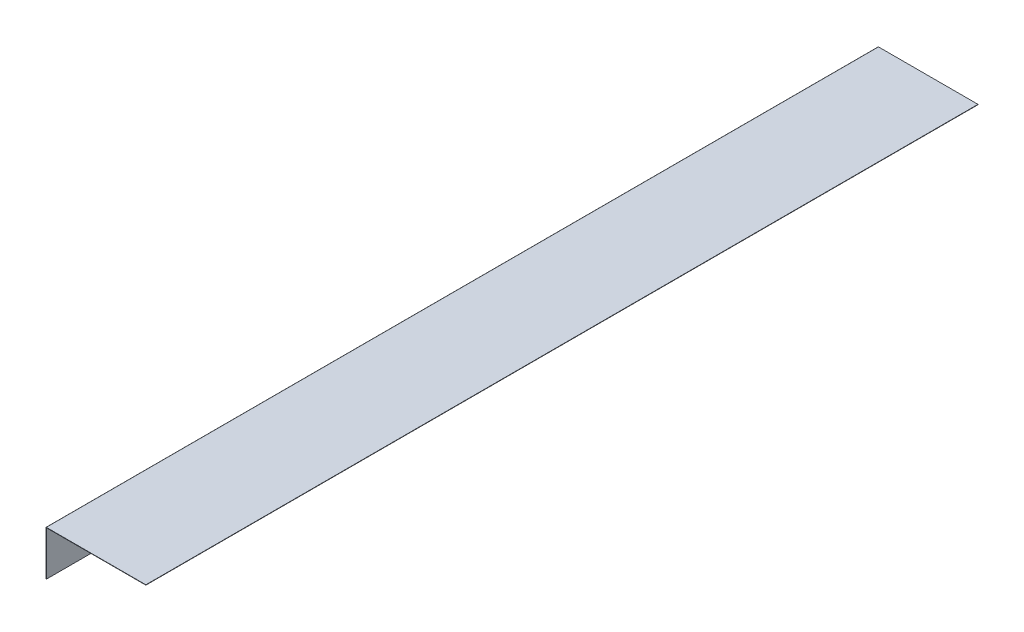
ISO-10303-21;
HEADER;
FILE_DESCRIPTION(('STEP AP214'),'2;1');
FILE_NAME('part.step','',(''),(''),'','','');
FILE_SCHEMA(('AUTOMOTIVE_DESIGN { 1 0 10303 214 1 1 1 1 }'));
ENDSEC;
DATA;
#1=APPLICATION_CONTEXT('core data for automotive mechanical design processes');
#2=APPLICATION_PROTOCOL_DEFINITION('international standard','automotive_design',2000,#1);
#3=PRODUCT_CONTEXT('',#1,'mechanical');
#4=PRODUCT('Part','Part','',(#3));
#5=PRODUCT_RELATED_PRODUCT_CATEGORY('part','',(#4));
#6=PRODUCT_DEFINITION_FORMATION('','',#4);
#7=PRODUCT_DEFINITION_CONTEXT('part definition',#1,'design');
#8=PRODUCT_DEFINITION('design','',#6,#7);
#9=PRODUCT_DEFINITION_SHAPE('','',#8);
#10=(LENGTH_UNIT() NAMED_UNIT(*) SI_UNIT(.MILLI.,.METRE.));
#11=(NAMED_UNIT(*) PLANE_ANGLE_UNIT() SI_UNIT($,.RADIAN.));
#12=(NAMED_UNIT(*) SI_UNIT($,.STERADIAN.) SOLID_ANGLE_UNIT());
#13=UNCERTAINTY_MEASURE_WITH_UNIT(LENGTH_MEASURE(1.E-05),#10,'distance_accuracy_value','');
#14=(GEOMETRIC_REPRESENTATION_CONTEXT(3) GLOBAL_UNCERTAINTY_ASSIGNED_CONTEXT((#13)) GLOBAL_UNIT_ASSIGNED_CONTEXT((#10,
#11,#12)) REPRESENTATION_CONTEXT('',''));
#15=CARTESIAN_POINT('',(0.,0.,0.));
#16=DIRECTION('',(0.,0.,1.));
#17=DIRECTION('',(1.,0.,0.));
#18=AXIS2_PLACEMENT_3D('',#15,#16,#17);
#19=CARTESIAN_POINT('',(1.,0.,2500.));
#20=DIRECTION('',(0.,1.,0.));
#21=DIRECTION('',(-1.,0.,0.));
#22=AXIS2_PLACEMENT_3D('',#19,#20,#21);
#23=PLANE('',#22);
#24=DIRECTION('',(1.,0.,0.));
#25=VECTOR('',#24,1.);
#26=CARTESIAN_POINT('',(1.,0.,0.));
#27=LINE('',#26,#25);
#28=CARTESIAN_POINT('',(0.,0.,0.));
#29=VERTEX_POINT('',#28);
#30=CARTESIAN_POINT('',(1.,0.,0.));
#31=VERTEX_POINT('',#30);
#32=EDGE_CURVE('E120',#29,#31,#27,.T.);
#33=ORIENTED_EDGE('',*,*,#32,.T.);
#34=DIRECTION('',(0.,0.,-1.));
#35=VECTOR('',#34,1.);
#36=CARTESIAN_POINT('',(1.,0.,2500.));
#37=LINE('',#36,#35);
#38=CARTESIAN_POINT('',(1.,0.,2500.));
#39=VERTEX_POINT('',#38);
#40=EDGE_CURVE('E104',#39,#31,#37,.T.);
#41=ORIENTED_EDGE('',*,*,#40,.F.);
#42=DIRECTION('',(1.,0.,0.));
#43=VECTOR('',#42,1.);
#44=CARTESIAN_POINT('',(1.,0.,2500.));
#45=LINE('',#44,#43);
#46=CARTESIAN_POINT('',(0.,0.,2500.));
#47=VERTEX_POINT('',#46);
#48=EDGE_CURVE('E107',#47,#39,#45,.T.);
#49=ORIENTED_EDGE('',*,*,#48,.F.);
#50=DIRECTION('',(0.,0.,-1.));
#51=VECTOR('',#50,1.);
#52=CARTESIAN_POINT('',(0.,0.,2500.));
#53=LINE('',#52,#51);
#54=EDGE_CURVE('E161',#47,#29,#53,.T.);
#55=ORIENTED_EDGE('',*,*,#54,.T.);
#56=EDGE_LOOP('',(#33,#41,#49,#55));
#57=FACE_BOUND('',#56,.T.);
#58=ADVANCED_FACE('F38',(#57),#23,.F.);
#59=CARTESIAN_POINT('',(1.,134.,2500.));
#60=DIRECTION('',(-1.,0.,0.));
#61=DIRECTION('',(0.,-1.,0.));
#62=AXIS2_PLACEMENT_3D('',#59,#60,#61);
#63=PLANE('',#62);
#64=DIRECTION('',(0.,1.,0.));
#65=VECTOR('',#64,1.);
#66=CARTESIAN_POINT('',(1.,134.,0.));
#67=LINE('',#66,#65);
#68=CARTESIAN_POINT('',(1.,133.,0.));
#69=VERTEX_POINT('',#68);
#70=EDGE_CURVE('E144',#31,#69,#67,.T.);
#71=ORIENTED_EDGE('',*,*,#70,.T.);
#72=DIRECTION('',(0.,0.,-1.));
#73=VECTOR('',#72,1.);
#74=CARTESIAN_POINT('',(1.,133.,2500.));
#75=LINE('',#74,#73);
#76=CARTESIAN_POINT('',(1.,133.,2500.));
#77=VERTEX_POINT('',#76);
#78=EDGE_CURVE('E59',#69,#77,#75,.F.);
#79=ORIENTED_EDGE('',*,*,#78,.T.);
#80=DIRECTION('',(0.,1.,0.));
#81=VECTOR('',#80,1.);
#82=CARTESIAN_POINT('',(1.,134.,2500.));
#83=LINE('',#82,#81);
#84=EDGE_CURVE('E100',#39,#77,#83,.T.);
#85=ORIENTED_EDGE('',*,*,#84,.F.);
#86=ORIENTED_EDGE('',*,*,#40,.T.);
#87=EDGE_LOOP('',(#71,#79,#85,#86));
#88=FACE_BOUND('',#87,.T.);
#89=ADVANCED_FACE('F102',(#88),#63,.F.);
#90=CARTESIAN_POINT('',(300.,134.,2500.));
#91=DIRECTION('',(0.,1.,0.));
#92=DIRECTION('',(-1.,0.,0.));
#93=AXIS2_PLACEMENT_3D('',#90,#91,#92);
#94=PLANE('',#93);
#95=DIRECTION('',(1.,0.,0.));
#96=VECTOR('',#95,1.);
#97=CARTESIAN_POINT('',(300.,134.,2500.));
#98=LINE('',#97,#96);
#99=CARTESIAN_POINT('',(2.,134.,2500.));
#100=VERTEX_POINT('',#99);
#101=CARTESIAN_POINT('',(300.,134.,2500.));
#102=VERTEX_POINT('',#101);
#103=EDGE_CURVE('E106',#100,#102,#98,.T.);
#104=ORIENTED_EDGE('',*,*,#103,.F.);
#105=DIRECTION('',(0.,0.,-1.));
#106=VECTOR('',#105,1.);
#107=CARTESIAN_POINT('',(2.,134.,0.));
#108=LINE('',#107,#106);
#109=CARTESIAN_POINT('',(2.,134.,0.));
#110=VERTEX_POINT('',#109);
#111=EDGE_CURVE('E137',#100,#110,#108,.T.);
#112=ORIENTED_EDGE('',*,*,#111,.T.);
#113=DIRECTION('',(1.,0.,0.));
#114=VECTOR('',#113,1.);
#115=CARTESIAN_POINT('',(300.,134.,0.));
#116=LINE('',#115,#114);
#117=CARTESIAN_POINT('',(300.,134.,0.));
#118=VERTEX_POINT('',#117);
#119=EDGE_CURVE('E146',#110,#118,#116,.T.);
#120=ORIENTED_EDGE('',*,*,#119,.T.);
#121=DIRECTION('',(0.,0.,-1.));
#122=VECTOR('',#121,1.);
#123=CARTESIAN_POINT('',(300.,134.,2500.));
#124=LINE('',#123,#122);
#125=EDGE_CURVE('E122',#102,#118,#124,.T.);
#126=ORIENTED_EDGE('',*,*,#125,.F.);
#127=EDGE_LOOP('',(#104,#112,#120,#126));
#128=FACE_BOUND('',#127,.T.);
#129=ADVANCED_FACE('F151',(#128),#94,.F.);
#130=CARTESIAN_POINT('',(300.,135.,2500.));
#131=DIRECTION('',(-1.,0.,0.));
#132=DIRECTION('',(0.,0.,1.));
#133=AXIS2_PLACEMENT_3D('',#130,#131,#132);
#134=PLANE('',#133);
#135=DIRECTION('',(0.,1.,0.));
#136=VECTOR('',#135,1.);
#137=CARTESIAN_POINT('',(300.,135.,0.));
#138=LINE('',#137,#136);
#139=CARTESIAN_POINT('',(300.,135.,0.));
#140=VERTEX_POINT('',#139);
#141=EDGE_CURVE('E164',#118,#140,#138,.T.);
#142=ORIENTED_EDGE('',*,*,#141,.T.);
#143=DIRECTION('',(0.,0.,-1.));
#144=VECTOR('',#143,1.);
#145=CARTESIAN_POINT('',(300.,135.,2500.));
#146=LINE('',#145,#144);
#147=CARTESIAN_POINT('',(300.,135.,2500.));
#148=VERTEX_POINT('',#147);
#149=EDGE_CURVE('E128',#148,#140,#146,.T.);
#150=ORIENTED_EDGE('',*,*,#149,.F.);
#151=DIRECTION('',(0.,1.,0.));
#152=VECTOR('',#151,1.);
#153=CARTESIAN_POINT('',(300.,135.,2500.));
#154=LINE('',#153,#152);
#155=EDGE_CURVE('E154',#102,#148,#154,.T.);
#156=ORIENTED_EDGE('',*,*,#155,.F.);
#157=ORIENTED_EDGE('',*,*,#125,.T.);
#158=EDGE_LOOP('',(#142,#150,#156,#157));
#159=FACE_BOUND('',#158,.T.);
#160=ADVANCED_FACE('F191',(#159),#134,.F.);
#161=CARTESIAN_POINT('',(0.,135.,2500.));
#162=DIRECTION('',(0.,-1.,0.));
#163=DIRECTION('',(0.,0.,-1.));
#164=AXIS2_PLACEMENT_3D('',#161,#162,#163);
#165=PLANE('',#164);
#166=DIRECTION('',(-1.,0.,0.));
#167=VECTOR('',#166,1.);
#168=CARTESIAN_POINT('',(0.,135.,0.));
#169=LINE('',#168,#167);
#170=CARTESIAN_POINT('',(1.,135.,0.));
#171=VERTEX_POINT('',#170);
#172=EDGE_CURVE('E166',#140,#171,#169,.T.);
#173=ORIENTED_EDGE('',*,*,#172,.T.);
#174=DIRECTION('',(0.,0.,-1.));
#175=VECTOR('',#174,1.);
#176=CARTESIAN_POINT('',(1.,135.,2500.));
#177=LINE('',#176,#175);
#178=CARTESIAN_POINT('',(1.,135.,2500.));
#179=VERTEX_POINT('',#178);
#180=EDGE_CURVE('E133',#171,#179,#177,.F.);
#181=ORIENTED_EDGE('',*,*,#180,.T.);
#182=DIRECTION('',(-1.,0.,0.));
#183=VECTOR('',#182,1.);
#184=CARTESIAN_POINT('',(0.,135.,2500.));
#185=LINE('',#184,#183);
#186=EDGE_CURVE('E156',#148,#179,#185,.T.);
#187=ORIENTED_EDGE('',*,*,#186,.F.);
#188=ORIENTED_EDGE('',*,*,#149,.T.);
#189=EDGE_LOOP('',(#173,#181,#187,#188));
#190=FACE_BOUND('',#189,.T.);
#191=ADVANCED_FACE('F175',(#190),#165,.F.);
#192=CARTESIAN_POINT('',(0.,0.,2500.));
#193=DIRECTION('',(1.,0.,0.));
#194=DIRECTION('',(0.,0.,-1.));
#195=AXIS2_PLACEMENT_3D('',#192,#193,#194);
#196=PLANE('',#195);
#197=DIRECTION('',(0.,-1.,0.));
#198=VECTOR('',#197,1.);
#199=CARTESIAN_POINT('',(0.,0.,2500.));
#200=LINE('',#199,#198);
#201=CARTESIAN_POINT('',(0.,134.,2500.));
#202=VERTEX_POINT('',#201);
#203=EDGE_CURVE('E113',#202,#47,#200,.T.);
#204=ORIENTED_EDGE('',*,*,#203,.F.);
#205=DIRECTION('',(0.,0.,-1.));
#206=VECTOR('',#205,1.);
#207=CARTESIAN_POINT('',(0.,134.,2500.));
#208=LINE('',#207,#206);
#209=CARTESIAN_POINT('',(0.,134.,0.));
#210=VERTEX_POINT('',#209);
#211=EDGE_CURVE('E121',#202,#210,#208,.T.);
#212=ORIENTED_EDGE('',*,*,#211,.T.);
#213=DIRECTION('',(0.,-1.,0.));
#214=VECTOR('',#213,1.);
#215=CARTESIAN_POINT('',(0.,0.,0.));
#216=LINE('',#215,#214);
#217=EDGE_CURVE('E117',#210,#29,#216,.T.);
#218=ORIENTED_EDGE('',*,*,#217,.T.);
#219=ORIENTED_EDGE('',*,*,#54,.F.);
#220=EDGE_LOOP('',(#204,#212,#218,#219));
#221=FACE_BOUND('',#220,.T.);
#222=ADVANCED_FACE('F183',(#221),#196,.F.);
#223=CARTESIAN_POINT('',(0.,0.,2500.));
#224=DIRECTION('',(0.,0.,-1.));
#225=DIRECTION('',(-1.,0.,0.));
#226=AXIS2_PLACEMENT_3D('',#223,#224,#225);
#227=PLANE('',#226);
#228=ORIENTED_EDGE('',*,*,#186,.T.);
#229=CARTESIAN_POINT('',(1.,134.,2500.));
#230=DIRECTION('',(0.,0.,-1.));
#231=DIRECTION('',(-1.,0.,0.));
#232=AXIS2_PLACEMENT_3D('',#229,#230,#231);
#233=CIRCLE('',#232,1.);
#234=EDGE_CURVE('E135',#179,#202,#233,.F.);
#235=ORIENTED_EDGE('',*,*,#234,.T.);
#236=ORIENTED_EDGE('',*,*,#203,.T.);
#237=ORIENTED_EDGE('',*,*,#48,.T.);
#238=ORIENTED_EDGE('',*,*,#84,.T.);
#239=CARTESIAN_POINT('',(2.,133.,2500.));
#240=DIRECTION('',(0.,0.,-1.));
#241=DIRECTION('',(-1.,0.,0.));
#242=AXIS2_PLACEMENT_3D('',#239,#240,#241);
#243=CIRCLE('',#242,1.);
#244=EDGE_CURVE('E11',#77,#100,#243,.T.);
#245=ORIENTED_EDGE('',*,*,#244,.T.);
#246=ORIENTED_EDGE('',*,*,#103,.T.);
#247=ORIENTED_EDGE('',*,*,#155,.T.);
#248=EDGE_LOOP('',(#228,#235,#236,#237,#238,#245,#246,#247));
#249=FACE_BOUND('',#248,.T.);
#250=ADVANCED_FACE('F111',(#249),#227,.F.);
#251=CARTESIAN_POINT('',(0.,0.,0.));
#252=DIRECTION('',(0.,0.,-1.));
#253=DIRECTION('',(-1.,0.,0.));
#254=AXIS2_PLACEMENT_3D('',#251,#252,#253);
#255=PLANE('',#254);
#256=ORIENTED_EDGE('',*,*,#217,.F.);
#257=CARTESIAN_POINT('',(1.,134.,0.));
#258=DIRECTION('',(0.,0.,-1.));
#259=DIRECTION('',(-1.,0.,0.));
#260=AXIS2_PLACEMENT_3D('',#257,#258,#259);
#261=CIRCLE('',#260,1.);
#262=EDGE_CURVE('E125',#210,#171,#261,.T.);
#263=ORIENTED_EDGE('',*,*,#262,.T.);
#264=ORIENTED_EDGE('',*,*,#172,.F.);
#265=ORIENTED_EDGE('',*,*,#141,.F.);
#266=ORIENTED_EDGE('',*,*,#119,.F.);
#267=CARTESIAN_POINT('',(2.,133.,0.));
#268=DIRECTION('',(0.,0.,-1.));
#269=DIRECTION('',(-1.,0.,0.));
#270=AXIS2_PLACEMENT_3D('',#267,#268,#269);
#271=CIRCLE('',#270,1.);
#272=EDGE_CURVE('E46',#110,#69,#271,.F.);
#273=ORIENTED_EDGE('',*,*,#272,.T.);
#274=ORIENTED_EDGE('',*,*,#70,.F.);
#275=ORIENTED_EDGE('',*,*,#32,.F.);
#276=EDGE_LOOP('',(#256,#263,#264,#265,#266,#273,#274,#275));
#277=FACE_BOUND('',#276,.T.);
#278=ADVANCED_FACE('F143',(#277),#255,.T.);
#279=CARTESIAN_POINT('',(1.,134.,2500.));
#280=DIRECTION('',(0.,0.,-1.));
#281=DIRECTION('',(-1.,0.,0.));
#282=AXIS2_PLACEMENT_3D('',#279,#280,#281);
#283=CYLINDRICAL_SURFACE('',#282,1.);
#284=ORIENTED_EDGE('',*,*,#234,.F.);
#285=ORIENTED_EDGE('',*,*,#180,.F.);
#286=ORIENTED_EDGE('',*,*,#262,.F.);
#287=ORIENTED_EDGE('',*,*,#211,.F.);
#288=EDGE_LOOP('',(#284,#285,#286,#287));
#289=FACE_BOUND('',#288,.T.);
#290=ADVANCED_FACE('F181',(#289),#283,.T.);
#291=CARTESIAN_POINT('',(2.,133.,2500.));
#292=DIRECTION('',(0.,0.,1.));
#293=DIRECTION('',(1.,0.,0.));
#294=AXIS2_PLACEMENT_3D('',#291,#292,#293);
#295=CYLINDRICAL_SURFACE('',#294,1.);
#296=ORIENTED_EDGE('',*,*,#244,.F.);
#297=ORIENTED_EDGE('',*,*,#78,.F.);
#298=ORIENTED_EDGE('',*,*,#272,.F.);
#299=ORIENTED_EDGE('',*,*,#111,.F.);
#300=EDGE_LOOP('',(#296,#297,#298,#299));
#301=FACE_BOUND('',#300,.T.);
#302=ADVANCED_FACE('F40',(#301),#295,.F.);
#303=CLOSED_SHELL('',(#58,#89,#129,#160,#191,#222,#250,#278,#290,#302));
#304=MANIFOLD_SOLID_BREP('B2',#303);
#305=ADVANCED_BREP_SHAPE_REPRESENTATION('',(#18,#304),#14);
#306=SHAPE_DEFINITION_REPRESENTATION(#9,#305);
ENDSEC;
END-ISO-10303-21;
